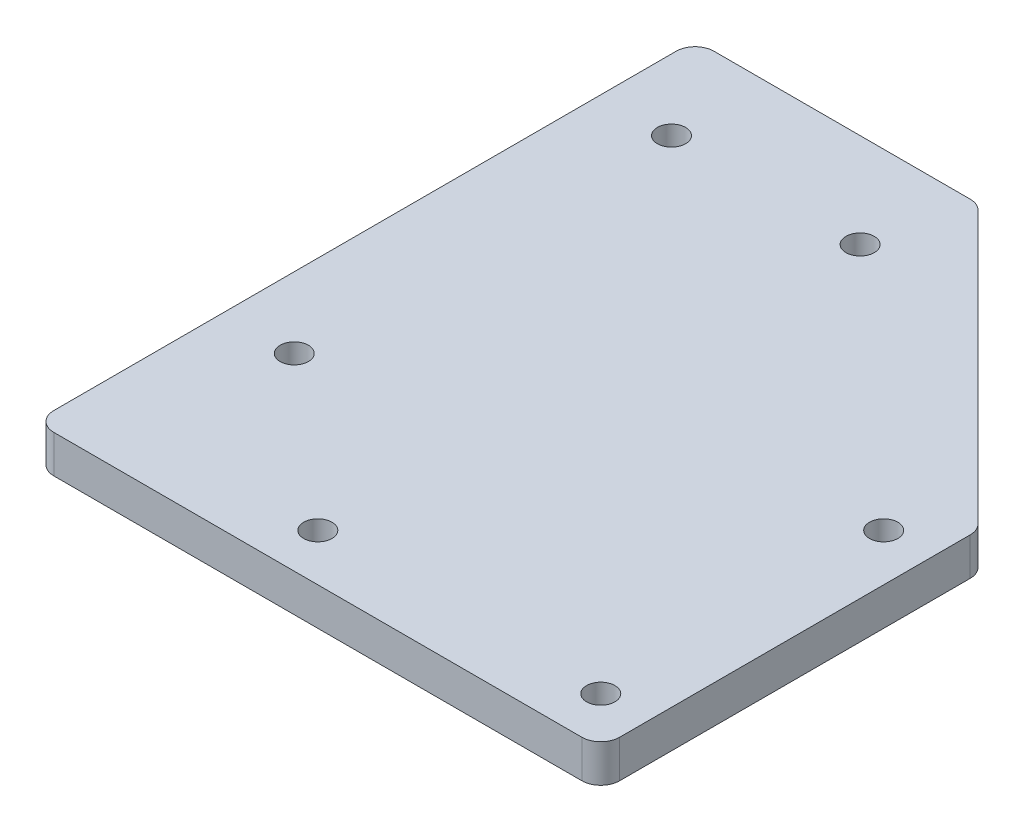
ISO-10303-21;
HEADER;
FILE_DESCRIPTION(('STEP AP214'),'2;1');
FILE_NAME('part.step','',(''),(''),'','','');
FILE_SCHEMA(('AUTOMOTIVE_DESIGN { 1 0 10303 214 1 1 1 1 }'));
ENDSEC;
DATA;
#1=APPLICATION_CONTEXT('core data for automotive mechanical design processes');
#2=APPLICATION_PROTOCOL_DEFINITION('international standard','automotive_design',2000,#1);
#3=PRODUCT_CONTEXT('',#1,'mechanical');
#4=PRODUCT('Part','Part','',(#3));
#5=PRODUCT_RELATED_PRODUCT_CATEGORY('part','',(#4));
#6=PRODUCT_DEFINITION_FORMATION('','',#4);
#7=PRODUCT_DEFINITION_CONTEXT('part definition',#1,'design');
#8=PRODUCT_DEFINITION('design','',#6,#7);
#9=PRODUCT_DEFINITION_SHAPE('','',#8);
#10=(LENGTH_UNIT() NAMED_UNIT(*) SI_UNIT(.MILLI.,.METRE.));
#11=(NAMED_UNIT(*) PLANE_ANGLE_UNIT() SI_UNIT($,.RADIAN.));
#12=(NAMED_UNIT(*) SI_UNIT($,.STERADIAN.) SOLID_ANGLE_UNIT());
#13=UNCERTAINTY_MEASURE_WITH_UNIT(LENGTH_MEASURE(1.E-05),#10,'distance_accuracy_value','');
#14=(GEOMETRIC_REPRESENTATION_CONTEXT(3) GLOBAL_UNCERTAINTY_ASSIGNED_CONTEXT((#13)) GLOBAL_UNIT_ASSIGNED_CONTEXT((#10,
#11,#12)) REPRESENTATION_CONTEXT('',''));
#15=CARTESIAN_POINT('',(0.,0.,0.));
#16=DIRECTION('',(0.,0.,1.));
#17=DIRECTION('',(1.,0.,0.));
#18=AXIS2_PLACEMENT_3D('',#15,#16,#17);
#19=CARTESIAN_POINT('',(0.,4.,-70.));
#20=DIRECTION('',(1.,0.,0.));
#21=DIRECTION('',(0.,0.,-1.));
#22=AXIS2_PLACEMENT_3D('',#19,#20,#21);
#23=PLANE('',#22);
#24=DIRECTION('',(0.,0.,1.));
#25=VECTOR('',#24,1.);
#26=CARTESIAN_POINT('',(0.,0.,-70.));
#27=LINE('',#26,#25);
#28=CARTESIAN_POINT('',(0.,0.,-68.));
#29=VERTEX_POINT('',#28);
#30=CARTESIAN_POINT('',(0.,0.,-2.));
#31=VERTEX_POINT('',#30);
#32=EDGE_CURVE('E140',#29,#31,#27,.T.);
#33=ORIENTED_EDGE('',*,*,#32,.T.);
#34=DIRECTION('',(0.,-1.,0.));
#35=VECTOR('',#34,1.);
#36=CARTESIAN_POINT('',(0.,4.,-2.));
#37=LINE('',#36,#35);
#38=CARTESIAN_POINT('',(0.,4.,-2.));
#39=VERTEX_POINT('',#38);
#40=EDGE_CURVE('E118',#31,#39,#37,.F.);
#41=ORIENTED_EDGE('',*,*,#40,.T.);
#42=DIRECTION('',(0.,0.,1.));
#43=VECTOR('',#42,1.);
#44=CARTESIAN_POINT('',(0.,4.,-70.));
#45=LINE('',#44,#43);
#46=CARTESIAN_POINT('',(0.,4.,-68.));
#47=VERTEX_POINT('',#46);
#48=EDGE_CURVE('E153',#47,#39,#45,.T.);
#49=ORIENTED_EDGE('',*,*,#48,.F.);
#50=DIRECTION('',(0.,-1.,0.));
#51=VECTOR('',#50,1.);
#52=CARTESIAN_POINT('',(0.,4.,-68.));
#53=LINE('',#52,#51);
#54=EDGE_CURVE('E123',#47,#29,#53,.T.);
#55=ORIENTED_EDGE('',*,*,#54,.T.);
#56=EDGE_LOOP('',(#33,#41,#49,#55));
#57=FACE_BOUND('',#56,.T.);
#58=ADVANCED_FACE('F35',(#57),#23,.F.);
#59=CARTESIAN_POINT('',(0.,4.,0.));
#60=DIRECTION('',(0.,0.,-1.));
#61=DIRECTION('',(-1.,0.,0.));
#62=AXIS2_PLACEMENT_3D('',#59,#60,#61);
#63=PLANE('',#62);
#64=DIRECTION('',(1.,0.,0.));
#65=VECTOR('',#64,1.);
#66=CARTESIAN_POINT('',(0.,4.,0.));
#67=LINE('',#66,#65);
#68=CARTESIAN_POINT('',(2.,4.,0.));
#69=VERTEX_POINT('',#68);
#70=CARTESIAN_POINT('',(58.,4.,0.));
#71=VERTEX_POINT('',#70);
#72=EDGE_CURVE('E133',#69,#71,#67,.T.);
#73=ORIENTED_EDGE('',*,*,#72,.F.);
#74=DIRECTION('',(0.,-1.,0.));
#75=VECTOR('',#74,1.);
#76=CARTESIAN_POINT('',(2.,4.,0.));
#77=LINE('',#76,#75);
#78=CARTESIAN_POINT('',(2.,0.,0.));
#79=VERTEX_POINT('',#78);
#80=EDGE_CURVE('E117',#69,#79,#77,.T.);
#81=ORIENTED_EDGE('',*,*,#80,.T.);
#82=DIRECTION('',(1.,0.,0.));
#83=VECTOR('',#82,1.);
#84=CARTESIAN_POINT('',(0.,0.,0.));
#85=LINE('',#84,#83);
#86=CARTESIAN_POINT('',(58.,0.,0.));
#87=VERTEX_POINT('',#86);
#88=EDGE_CURVE('E130',#79,#87,#85,.T.);
#89=ORIENTED_EDGE('',*,*,#88,.T.);
#90=DIRECTION('',(0.,-1.,0.));
#91=VECTOR('',#90,1.);
#92=CARTESIAN_POINT('',(58.,4.,0.));
#93=LINE('',#92,#91);
#94=EDGE_CURVE('E135',#87,#71,#93,.F.);
#95=ORIENTED_EDGE('',*,*,#94,.T.);
#96=EDGE_LOOP('',(#73,#81,#89,#95));
#97=FACE_BOUND('',#96,.T.);
#98=ADVANCED_FACE('F129',(#97),#63,.F.);
#99=CARTESIAN_POINT('',(60.,4.,0.));
#100=DIRECTION('',(-1.,0.,0.));
#101=DIRECTION('',(0.,0.,1.));
#102=AXIS2_PLACEMENT_3D('',#99,#100,#101);
#103=PLANE('',#102);
#104=DIRECTION('',(0.,0.,-1.));
#105=VECTOR('',#104,1.);
#106=CARTESIAN_POINT('',(60.,0.,0.));
#107=LINE('',#106,#105);
#108=CARTESIAN_POINT('',(60.,0.,-2.));
#109=VERTEX_POINT('',#108);
#110=CARTESIAN_POINT('',(60.,0.,-39.1715728752538));
#111=VERTEX_POINT('',#110);
#112=EDGE_CURVE('E139',#109,#111,#107,.T.);
#113=ORIENTED_EDGE('',*,*,#112,.T.);
#114=DIRECTION('',(0.,-1.,0.));
#115=VECTOR('',#114,1.);
#116=CARTESIAN_POINT('',(60.,4.,-39.1715728752538));
#117=LINE('',#116,#115);
#118=CARTESIAN_POINT('',(60.,4.,-39.1715728752538));
#119=VERTEX_POINT('',#118);
#120=EDGE_CURVE('E11',#111,#119,#117,.F.);
#121=ORIENTED_EDGE('',*,*,#120,.T.);
#122=DIRECTION('',(0.,0.,-1.));
#123=VECTOR('',#122,1.);
#124=CARTESIAN_POINT('',(60.,4.,0.));
#125=LINE('',#124,#123);
#126=CARTESIAN_POINT('',(60.,4.,-2.));
#127=VERTEX_POINT('',#126);
#128=EDGE_CURVE('E189',#127,#119,#125,.T.);
#129=ORIENTED_EDGE('',*,*,#128,.F.);
#130=DIRECTION('',(0.,-1.,0.));
#131=VECTOR('',#130,1.);
#132=CARTESIAN_POINT('',(60.,4.,-2.));
#133=LINE('',#132,#131);
#134=EDGE_CURVE('E43',#127,#109,#133,.T.);
#135=ORIENTED_EDGE('',*,*,#134,.T.);
#136=EDGE_LOOP('',(#113,#121,#129,#135));
#137=FACE_BOUND('',#136,.T.);
#138=ADVANCED_FACE('F186',(#137),#103,.F.);
#139=CARTESIAN_POINT('',(60.,4.,-40.));
#140=DIRECTION('',(-0.707106781186546,0.,0.707106781186549));
#141=DIRECTION('',(0.707106781186549,0.,0.707106781186546));
#142=AXIS2_PLACEMENT_3D('',#139,#140,#141);
#143=PLANE('',#142);
#144=DIRECTION('',(-0.707106781186549,0.,-0.707106781186546));
#145=VECTOR('',#144,1.);
#146=CARTESIAN_POINT('',(60.,0.,-40.));
#147=LINE('',#146,#145);
#148=CARTESIAN_POINT('',(59.4142135623731,0.,-40.5857864376269));
#149=VERTEX_POINT('',#148);
#150=CARTESIAN_POINT('',(30.5857864376268,0.,-69.4142135623731));
#151=VERTEX_POINT('',#150);
#152=EDGE_CURVE('E143',#149,#151,#147,.T.);
#153=ORIENTED_EDGE('',*,*,#152,.T.);
#154=DIRECTION('',(0.,-1.,0.));
#155=VECTOR('',#154,1.);
#156=CARTESIAN_POINT('',(30.5857864376268,4.,-69.4142135623731));
#157=LINE('',#156,#155);
#158=CARTESIAN_POINT('',(30.5857864376268,4.,-69.4142135623731));
#159=VERTEX_POINT('',#158);
#160=EDGE_CURVE('E181',#151,#159,#157,.F.);
#161=ORIENTED_EDGE('',*,*,#160,.T.);
#162=DIRECTION('',(-0.707106781186549,0.,-0.707106781186546));
#163=VECTOR('',#162,1.);
#164=CARTESIAN_POINT('',(60.,4.,-40.));
#165=LINE('',#164,#163);
#166=CARTESIAN_POINT('',(59.4142135623731,4.,-40.5857864376269));
#167=VERTEX_POINT('',#166);
#168=EDGE_CURVE('E201',#167,#159,#165,.T.);
#169=ORIENTED_EDGE('',*,*,#168,.F.);
#170=DIRECTION('',(0.,-1.,0.));
#171=VECTOR('',#170,1.);
#172=CARTESIAN_POINT('',(59.4142135623731,4.,-40.5857864376269));
#173=LINE('',#172,#171);
#174=EDGE_CURVE('E178',#167,#149,#173,.T.);
#175=ORIENTED_EDGE('',*,*,#174,.T.);
#176=EDGE_LOOP('',(#153,#161,#169,#175));
#177=FACE_BOUND('',#176,.T.);
#178=ADVANCED_FACE('F199',(#177),#143,.F.);
#179=CARTESIAN_POINT('',(29.9999999999999,4.,-70.));
#180=DIRECTION('',(0.,0.,1.));
#181=DIRECTION('',(1.,0.,0.));
#182=AXIS2_PLACEMENT_3D('',#179,#180,#181);
#183=PLANE('',#182);
#184=DIRECTION('',(-1.,0.,0.));
#185=VECTOR('',#184,1.);
#186=CARTESIAN_POINT('',(29.9999999999999,0.,-70.));
#187=LINE('',#186,#185);
#188=CARTESIAN_POINT('',(29.1715728752537,0.,-70.));
#189=VERTEX_POINT('',#188);
#190=CARTESIAN_POINT('',(2.,0.,-70.));
#191=VERTEX_POINT('',#190);
#192=EDGE_CURVE('E151',#189,#191,#187,.T.);
#193=ORIENTED_EDGE('',*,*,#192,.T.);
#194=DIRECTION('',(0.,-1.,0.));
#195=VECTOR('',#194,1.);
#196=CARTESIAN_POINT('',(2.,4.,-70.));
#197=LINE('',#196,#195);
#198=CARTESIAN_POINT('',(2.,4.,-70.));
#199=VERTEX_POINT('',#198);
#200=EDGE_CURVE('E50',#191,#199,#197,.F.);
#201=ORIENTED_EDGE('',*,*,#200,.T.);
#202=DIRECTION('',(-1.,0.,0.));
#203=VECTOR('',#202,1.);
#204=CARTESIAN_POINT('',(29.9999999999999,4.,-70.));
#205=LINE('',#204,#203);
#206=CARTESIAN_POINT('',(29.1715728752537,4.,-70.));
#207=VERTEX_POINT('',#206);
#208=EDGE_CURVE('E154',#207,#199,#205,.T.);
#209=ORIENTED_EDGE('',*,*,#208,.F.);
#210=DIRECTION('',(0.,-1.,0.));
#211=VECTOR('',#210,1.);
#212=CARTESIAN_POINT('',(29.1715728752537,4.,-70.));
#213=LINE('',#212,#211);
#214=EDGE_CURVE('E174',#207,#189,#213,.T.);
#215=ORIENTED_EDGE('',*,*,#214,.T.);
#216=EDGE_LOOP('',(#193,#201,#209,#215));
#217=FACE_BOUND('',#216,.T.);
#218=ADVANCED_FACE('F256',(#217),#183,.F.);
#219=CARTESIAN_POINT('',(0.,4.,0.));
#220=DIRECTION('',(0.,1.,0.));
#221=DIRECTION('',(0.,0.,1.));
#222=AXIS2_PLACEMENT_3D('',#219,#220,#221);
#223=PLANE('',#222);
#224=CARTESIAN_POINT('',(55.,4.,-35.));
#225=DIRECTION('',(0.,1.,0.));
#226=DIRECTION('',(0.,0.,1.));
#227=AXIS2_PLACEMENT_3D('',#224,#225,#226);
#228=CIRCLE('',#227,1.5);
#229=CARTESIAN_POINT('',(55.,4.,-33.5));
#230=VERTEX_POINT('',#229);
#231=EDGE_CURVE('E238',#230,#230,#228,.T.);
#232=ORIENTED_EDGE('',*,*,#231,.F.);
#233=EDGE_LOOP('',(#232));
#234=FACE_BOUND('',#233,.T.);
#235=CARTESIAN_POINT('',(25.,4.,-5.));
#236=DIRECTION('',(0.,1.,0.));
#237=DIRECTION('',(0.,0.,1.));
#238=AXIS2_PLACEMENT_3D('',#235,#236,#237);
#239=CIRCLE('',#238,1.5);
#240=CARTESIAN_POINT('',(25.,4.,-3.5));
#241=VERTEX_POINT('',#240);
#242=EDGE_CURVE('E232',#241,#241,#239,.T.);
#243=ORIENTED_EDGE('',*,*,#242,.F.);
#244=EDGE_LOOP('',(#243));
#245=FACE_BOUND('',#244,.T.);
#246=CARTESIAN_POINT('',(27.5,4.,-60.));
#247=DIRECTION('',(0.,1.,0.));
#248=DIRECTION('',(0.,0.,1.));
#249=AXIS2_PLACEMENT_3D('',#246,#247,#248);
#250=CIRCLE('',#249,1.5);
#251=CARTESIAN_POINT('',(27.5,4.,-58.5));
#252=VERTEX_POINT('',#251);
#253=EDGE_CURVE('E226',#252,#252,#250,.T.);
#254=ORIENTED_EDGE('',*,*,#253,.F.);
#255=EDGE_LOOP('',(#254));
#256=FACE_BOUND('',#255,.T.);
#257=CARTESIAN_POINT('',(55.,4.,-5.));
#258=DIRECTION('',(0.,1.,0.));
#259=DIRECTION('',(0.,0.,1.));
#260=AXIS2_PLACEMENT_3D('',#257,#258,#259);
#261=CIRCLE('',#260,1.5);
#262=CARTESIAN_POINT('',(55.,4.,-3.5));
#263=VERTEX_POINT('',#262);
#264=EDGE_CURVE('E220',#263,#263,#261,.T.);
#265=ORIENTED_EDGE('',*,*,#264,.F.);
#266=EDGE_LOOP('',(#265));
#267=FACE_BOUND('',#266,.T.);
#268=CARTESIAN_POINT('',(7.5,4.,-60.));
#269=DIRECTION('',(0.,1.,0.));
#270=DIRECTION('',(0.,0.,1.));
#271=AXIS2_PLACEMENT_3D('',#268,#269,#270);
#272=CIRCLE('',#271,1.5);
#273=CARTESIAN_POINT('',(7.5,4.,-58.5));
#274=VERTEX_POINT('',#273);
#275=EDGE_CURVE('E214',#274,#274,#272,.T.);
#276=ORIENTED_EDGE('',*,*,#275,.F.);
#277=EDGE_LOOP('',(#276));
#278=FACE_BOUND('',#277,.T.);
#279=CARTESIAN_POINT('',(7.5,4.,-20.));
#280=DIRECTION('',(0.,1.,0.));
#281=DIRECTION('',(0.,0.,1.));
#282=AXIS2_PLACEMENT_3D('',#279,#280,#281);
#283=CIRCLE('',#282,1.5);
#284=CARTESIAN_POINT('',(7.5,4.,-18.5));
#285=VERTEX_POINT('',#284);
#286=EDGE_CURVE('E208',#285,#285,#283,.T.);
#287=ORIENTED_EDGE('',*,*,#286,.F.);
#288=EDGE_LOOP('',(#287));
#289=FACE_BOUND('',#288,.T.);
#290=ORIENTED_EDGE('',*,*,#48,.T.);
#291=CARTESIAN_POINT('',(2.,4.,-2.));
#292=DIRECTION('',(0.,1.,0.));
#293=DIRECTION('',(0.,0.,1.));
#294=AXIS2_PLACEMENT_3D('',#291,#292,#293);
#295=CIRCLE('',#294,2.);
#296=EDGE_CURVE('E172',#39,#69,#295,.T.);
#297=ORIENTED_EDGE('',*,*,#296,.T.);
#298=ORIENTED_EDGE('',*,*,#72,.T.);
#299=CARTESIAN_POINT('',(58.,4.,-2.));
#300=DIRECTION('',(0.,1.,0.));
#301=DIRECTION('',(0.,0.,1.));
#302=AXIS2_PLACEMENT_3D('',#299,#300,#301);
#303=CIRCLE('',#302,2.);
#304=EDGE_CURVE('E165',#71,#127,#303,.T.);
#305=ORIENTED_EDGE('',*,*,#304,.T.);
#306=ORIENTED_EDGE('',*,*,#128,.T.);
#307=CARTESIAN_POINT('',(58.,4.,-39.1715728752538));
#308=DIRECTION('',(0.,1.,0.));
#309=DIRECTION('',(0.,0.,1.));
#310=AXIS2_PLACEMENT_3D('',#307,#308,#309);
#311=CIRCLE('',#310,2.);
#312=EDGE_CURVE('E167',#119,#167,#311,.T.);
#313=ORIENTED_EDGE('',*,*,#312,.T.);
#314=ORIENTED_EDGE('',*,*,#168,.T.);
#315=CARTESIAN_POINT('',(29.1715728752537,4.,-68.));
#316=DIRECTION('',(0.,1.,0.));
#317=DIRECTION('',(0.,0.,1.));
#318=AXIS2_PLACEMENT_3D('',#315,#316,#317);
#319=CIRCLE('',#318,2.);
#320=EDGE_CURVE('E57',#159,#207,#319,.T.);
#321=ORIENTED_EDGE('',*,*,#320,.T.);
#322=ORIENTED_EDGE('',*,*,#208,.T.);
#323=CARTESIAN_POINT('',(2.,4.,-68.));
#324=DIRECTION('',(0.,1.,0.));
#325=DIRECTION('',(0.,0.,1.));
#326=AXIS2_PLACEMENT_3D('',#323,#324,#325);
#327=CIRCLE('',#326,2.);
#328=EDGE_CURVE('E170',#199,#47,#327,.T.);
#329=ORIENTED_EDGE('',*,*,#328,.T.);
#330=EDGE_LOOP('',(#290,#297,#298,#305,#306,#313,#314,#321,#322,#329));
#331=FACE_BOUND('',#330,.T.);
#332=ADVANCED_FACE('F253',(#234,#245,#256,#267,#278,#289,#331),#223,.T.);
#333=CARTESIAN_POINT('',(0.,0.,0.));
#334=DIRECTION('',(0.,1.,0.));
#335=DIRECTION('',(0.,0.,1.));
#336=AXIS2_PLACEMENT_3D('',#333,#334,#335);
#337=PLANE('',#336);
#338=CARTESIAN_POINT('',(55.,0.,-35.));
#339=DIRECTION('',(0.,1.,0.));
#340=DIRECTION('',(0.,0.,1.));
#341=AXIS2_PLACEMENT_3D('',#338,#339,#340);
#342=CIRCLE('',#341,1.5);
#343=CARTESIAN_POINT('',(55.,0.,-33.5));
#344=VERTEX_POINT('',#343);
#345=EDGE_CURVE('E235',#344,#344,#342,.T.);
#346=ORIENTED_EDGE('',*,*,#345,.T.);
#347=EDGE_LOOP('',(#346));
#348=FACE_BOUND('',#347,.T.);
#349=CARTESIAN_POINT('',(25.,0.,-5.));
#350=DIRECTION('',(0.,1.,0.));
#351=DIRECTION('',(0.,0.,1.));
#352=AXIS2_PLACEMENT_3D('',#349,#350,#351);
#353=CIRCLE('',#352,1.5);
#354=CARTESIAN_POINT('',(25.,0.,-3.5));
#355=VERTEX_POINT('',#354);
#356=EDGE_CURVE('E229',#355,#355,#353,.T.);
#357=ORIENTED_EDGE('',*,*,#356,.T.);
#358=EDGE_LOOP('',(#357));
#359=FACE_BOUND('',#358,.T.);
#360=CARTESIAN_POINT('',(27.5,0.,-60.));
#361=DIRECTION('',(0.,1.,0.));
#362=DIRECTION('',(0.,0.,1.));
#363=AXIS2_PLACEMENT_3D('',#360,#361,#362);
#364=CIRCLE('',#363,1.5);
#365=CARTESIAN_POINT('',(27.5,0.,-58.5));
#366=VERTEX_POINT('',#365);
#367=EDGE_CURVE('E223',#366,#366,#364,.T.);
#368=ORIENTED_EDGE('',*,*,#367,.T.);
#369=EDGE_LOOP('',(#368));
#370=FACE_BOUND('',#369,.T.);
#371=CARTESIAN_POINT('',(55.,0.,-5.));
#372=DIRECTION('',(0.,1.,0.));
#373=DIRECTION('',(0.,0.,1.));
#374=AXIS2_PLACEMENT_3D('',#371,#372,#373);
#375=CIRCLE('',#374,1.5);
#376=CARTESIAN_POINT('',(55.,0.,-3.5));
#377=VERTEX_POINT('',#376);
#378=EDGE_CURVE('E217',#377,#377,#375,.T.);
#379=ORIENTED_EDGE('',*,*,#378,.T.);
#380=EDGE_LOOP('',(#379));
#381=FACE_BOUND('',#380,.T.);
#382=CARTESIAN_POINT('',(7.5,0.,-60.));
#383=DIRECTION('',(0.,1.,0.));
#384=DIRECTION('',(0.,0.,1.));
#385=AXIS2_PLACEMENT_3D('',#382,#383,#384);
#386=CIRCLE('',#385,1.5);
#387=CARTESIAN_POINT('',(7.5,0.,-58.5));
#388=VERTEX_POINT('',#387);
#389=EDGE_CURVE('E211',#388,#388,#386,.T.);
#390=ORIENTED_EDGE('',*,*,#389,.T.);
#391=EDGE_LOOP('',(#390));
#392=FACE_BOUND('',#391,.T.);
#393=CARTESIAN_POINT('',(7.5,0.,-20.));
#394=DIRECTION('',(0.,1.,0.));
#395=DIRECTION('',(0.,0.,1.));
#396=AXIS2_PLACEMENT_3D('',#393,#394,#395);
#397=CIRCLE('',#396,1.5);
#398=CARTESIAN_POINT('',(7.5,0.,-18.5));
#399=VERTEX_POINT('',#398);
#400=EDGE_CURVE('E145',#399,#399,#397,.T.);
#401=ORIENTED_EDGE('',*,*,#400,.T.);
#402=EDGE_LOOP('',(#401));
#403=FACE_BOUND('',#402,.T.);
#404=ORIENTED_EDGE('',*,*,#88,.F.);
#405=CARTESIAN_POINT('',(2.,0.,-2.));
#406=DIRECTION('',(0.,1.,0.));
#407=DIRECTION('',(0.,0.,1.));
#408=AXIS2_PLACEMENT_3D('',#405,#406,#407);
#409=CIRCLE('',#408,2.);
#410=EDGE_CURVE('E113',#79,#31,#409,.F.);
#411=ORIENTED_EDGE('',*,*,#410,.T.);
#412=ORIENTED_EDGE('',*,*,#32,.F.);
#413=CARTESIAN_POINT('',(2.,0.,-68.));
#414=DIRECTION('',(0.,1.,0.));
#415=DIRECTION('',(0.,0.,1.));
#416=AXIS2_PLACEMENT_3D('',#413,#414,#415);
#417=CIRCLE('',#416,2.);
#418=EDGE_CURVE('E124',#29,#191,#417,.F.);
#419=ORIENTED_EDGE('',*,*,#418,.T.);
#420=ORIENTED_EDGE('',*,*,#192,.F.);
#421=CARTESIAN_POINT('',(29.1715728752537,0.,-68.));
#422=DIRECTION('',(0.,1.,0.));
#423=DIRECTION('',(0.,0.,1.));
#424=AXIS2_PLACEMENT_3D('',#421,#422,#423);
#425=CIRCLE('',#424,2.);
#426=EDGE_CURVE('E159',#189,#151,#425,.F.);
#427=ORIENTED_EDGE('',*,*,#426,.T.);
#428=ORIENTED_EDGE('',*,*,#152,.F.);
#429=CARTESIAN_POINT('',(58.,0.,-39.1715728752538));
#430=DIRECTION('',(0.,1.,0.));
#431=DIRECTION('',(0.,0.,1.));
#432=AXIS2_PLACEMENT_3D('',#429,#430,#431);
#433=CIRCLE('',#432,2.);
#434=EDGE_CURVE('E157',#149,#111,#433,.F.);
#435=ORIENTED_EDGE('',*,*,#434,.T.);
#436=ORIENTED_EDGE('',*,*,#112,.F.);
#437=CARTESIAN_POINT('',(58.,0.,-2.));
#438=DIRECTION('',(0.,1.,0.));
#439=DIRECTION('',(0.,0.,1.));
#440=AXIS2_PLACEMENT_3D('',#437,#438,#439);
#441=CIRCLE('',#440,2.);
#442=EDGE_CURVE('E134',#109,#87,#441,.F.);
#443=ORIENTED_EDGE('',*,*,#442,.T.);
#444=EDGE_LOOP('',(#404,#411,#412,#419,#420,#427,#428,#435,#436,#443));
#445=FACE_BOUND('',#444,.T.);
#446=ADVANCED_FACE('F137',(#348,#359,#370,#381,#392,#403,#445),#337,.F.);
#447=CARTESIAN_POINT('',(7.5,0.,-20.));
#448=DIRECTION('',(0.,1.,0.));
#449=DIRECTION('',(0.,0.,1.));
#450=AXIS2_PLACEMENT_3D('',#447,#448,#449);
#451=CYLINDRICAL_SURFACE('',#450,1.5);
#452=ORIENTED_EDGE('',*,*,#400,.F.);
#453=EDGE_LOOP('',(#452));
#454=FACE_BOUND('',#453,.T.);
#455=ORIENTED_EDGE('',*,*,#286,.T.);
#456=EDGE_LOOP('',(#455));
#457=FACE_BOUND('',#456,.T.);
#458=ADVANCED_FACE('F298',(#454,#457),#451,.F.);
#459=CARTESIAN_POINT('',(7.5,0.,-60.));
#460=DIRECTION('',(0.,1.,0.));
#461=DIRECTION('',(0.,0.,1.));
#462=AXIS2_PLACEMENT_3D('',#459,#460,#461);
#463=CYLINDRICAL_SURFACE('',#462,1.5);
#464=ORIENTED_EDGE('',*,*,#389,.F.);
#465=EDGE_LOOP('',(#464));
#466=FACE_BOUND('',#465,.T.);
#467=ORIENTED_EDGE('',*,*,#275,.T.);
#468=EDGE_LOOP('',(#467));
#469=FACE_BOUND('',#468,.T.);
#470=ADVANCED_FACE('F294',(#466,#469),#463,.F.);
#471=CARTESIAN_POINT('',(2.,4.,-2.));
#472=DIRECTION('',(0.,-1.,0.));
#473=DIRECTION('',(0.,0.,-1.));
#474=AXIS2_PLACEMENT_3D('',#471,#472,#473);
#475=CYLINDRICAL_SURFACE('',#474,2.);
#476=ORIENTED_EDGE('',*,*,#296,.F.);
#477=ORIENTED_EDGE('',*,*,#40,.F.);
#478=ORIENTED_EDGE('',*,*,#410,.F.);
#479=ORIENTED_EDGE('',*,*,#80,.F.);
#480=EDGE_LOOP('',(#476,#477,#478,#479));
#481=FACE_BOUND('',#480,.T.);
#482=ADVANCED_FACE('F116',(#481),#475,.T.);
#483=CARTESIAN_POINT('',(2.,4.,-68.));
#484=DIRECTION('',(0.,-1.,0.));
#485=DIRECTION('',(0.,0.,-1.));
#486=AXIS2_PLACEMENT_3D('',#483,#484,#485);
#487=CYLINDRICAL_SURFACE('',#486,2.);
#488=ORIENTED_EDGE('',*,*,#328,.F.);
#489=ORIENTED_EDGE('',*,*,#200,.F.);
#490=ORIENTED_EDGE('',*,*,#418,.F.);
#491=ORIENTED_EDGE('',*,*,#54,.F.);
#492=EDGE_LOOP('',(#488,#489,#490,#491));
#493=FACE_BOUND('',#492,.T.);
#494=ADVANCED_FACE('F272',(#493),#487,.T.);
#495=CARTESIAN_POINT('',(29.1715728752537,4.,-68.));
#496=DIRECTION('',(0.,-1.,0.));
#497=DIRECTION('',(0.,0.,-1.));
#498=AXIS2_PLACEMENT_3D('',#495,#496,#497);
#499=CYLINDRICAL_SURFACE('',#498,2.);
#500=ORIENTED_EDGE('',*,*,#320,.F.);
#501=ORIENTED_EDGE('',*,*,#160,.F.);
#502=ORIENTED_EDGE('',*,*,#426,.F.);
#503=ORIENTED_EDGE('',*,*,#214,.F.);
#504=EDGE_LOOP('',(#500,#501,#502,#503));
#505=FACE_BOUND('',#504,.T.);
#506=ADVANCED_FACE('F276',(#505),#499,.T.);
#507=CARTESIAN_POINT('',(58.,4.,-39.1715728752538));
#508=DIRECTION('',(0.,-1.,0.));
#509=DIRECTION('',(0.,0.,-1.));
#510=AXIS2_PLACEMENT_3D('',#507,#508,#509);
#511=CYLINDRICAL_SURFACE('',#510,2.);
#512=ORIENTED_EDGE('',*,*,#312,.F.);
#513=ORIENTED_EDGE('',*,*,#120,.F.);
#514=ORIENTED_EDGE('',*,*,#434,.F.);
#515=ORIENTED_EDGE('',*,*,#174,.F.);
#516=EDGE_LOOP('',(#512,#513,#514,#515));
#517=FACE_BOUND('',#516,.T.);
#518=ADVANCED_FACE('F196',(#517),#511,.T.);
#519=CARTESIAN_POINT('',(58.,4.,-2.));
#520=DIRECTION('',(0.,-1.,0.));
#521=DIRECTION('',(0.,0.,-1.));
#522=AXIS2_PLACEMENT_3D('',#519,#520,#521);
#523=CYLINDRICAL_SURFACE('',#522,2.);
#524=ORIENTED_EDGE('',*,*,#304,.F.);
#525=ORIENTED_EDGE('',*,*,#94,.F.);
#526=ORIENTED_EDGE('',*,*,#442,.F.);
#527=ORIENTED_EDGE('',*,*,#134,.F.);
#528=EDGE_LOOP('',(#524,#525,#526,#527));
#529=FACE_BOUND('',#528,.T.);
#530=ADVANCED_FACE('F37',(#529),#523,.T.);
#531=CARTESIAN_POINT('',(55.,0.,-5.));
#532=DIRECTION('',(0.,1.,0.));
#533=DIRECTION('',(0.,0.,1.));
#534=AXIS2_PLACEMENT_3D('',#531,#532,#533);
#535=CYLINDRICAL_SURFACE('',#534,1.5);
#536=ORIENTED_EDGE('',*,*,#378,.F.);
#537=EDGE_LOOP('',(#536));
#538=FACE_BOUND('',#537,.T.);
#539=ORIENTED_EDGE('',*,*,#264,.T.);
#540=EDGE_LOOP('',(#539));
#541=FACE_BOUND('',#540,.T.);
#542=ADVANCED_FACE('F308',(#538,#541),#535,.F.);
#543=CARTESIAN_POINT('',(27.5,0.,-60.));
#544=DIRECTION('',(0.,1.,0.));
#545=DIRECTION('',(0.,0.,1.));
#546=AXIS2_PLACEMENT_3D('',#543,#544,#545);
#547=CYLINDRICAL_SURFACE('',#546,1.5);
#548=ORIENTED_EDGE('',*,*,#367,.F.);
#549=EDGE_LOOP('',(#548));
#550=FACE_BOUND('',#549,.T.);
#551=ORIENTED_EDGE('',*,*,#253,.T.);
#552=EDGE_LOOP('',(#551));
#553=FACE_BOUND('',#552,.T.);
#554=ADVANCED_FACE('F365',(#550,#553),#547,.F.);
#555=CARTESIAN_POINT('',(25.,0.,-5.));
#556=DIRECTION('',(0.,1.,0.));
#557=DIRECTION('',(0.,0.,1.));
#558=AXIS2_PLACEMENT_3D('',#555,#556,#557);
#559=CYLINDRICAL_SURFACE('',#558,1.5);
#560=ORIENTED_EDGE('',*,*,#356,.F.);
#561=EDGE_LOOP('',(#560));
#562=FACE_BOUND('',#561,.T.);
#563=ORIENTED_EDGE('',*,*,#242,.T.);
#564=EDGE_LOOP('',(#563));
#565=FACE_BOUND('',#564,.T.);
#566=ADVANCED_FACE('F249',(#562,#565),#559,.F.);
#567=CARTESIAN_POINT('',(55.,0.,-35.));
#568=DIRECTION('',(0.,1.,0.));
#569=DIRECTION('',(0.,0.,1.));
#570=AXIS2_PLACEMENT_3D('',#567,#568,#569);
#571=CYLINDRICAL_SURFACE('',#570,1.5);
#572=ORIENTED_EDGE('',*,*,#345,.F.);
#573=EDGE_LOOP('',(#572));
#574=FACE_BOUND('',#573,.T.);
#575=ORIENTED_EDGE('',*,*,#231,.T.);
#576=EDGE_LOOP('',(#575));
#577=FACE_BOUND('',#576,.T.);
#578=ADVANCED_FACE('F246',(#574,#577),#571,.F.);
#579=CLOSED_SHELL('',(#58,#98,#138,#178,#218,#332,#446,#458,#470,#482,#494,#506,#518,#530,#542,
#554,#566,#578));
#580=MANIFOLD_SOLID_BREP('B2',#579);
#581=ADVANCED_BREP_SHAPE_REPRESENTATION('',(#18,#580),#14);
#582=SHAPE_DEFINITION_REPRESENTATION(#9,#581);
ENDSEC;
END-ISO-10303-21;
